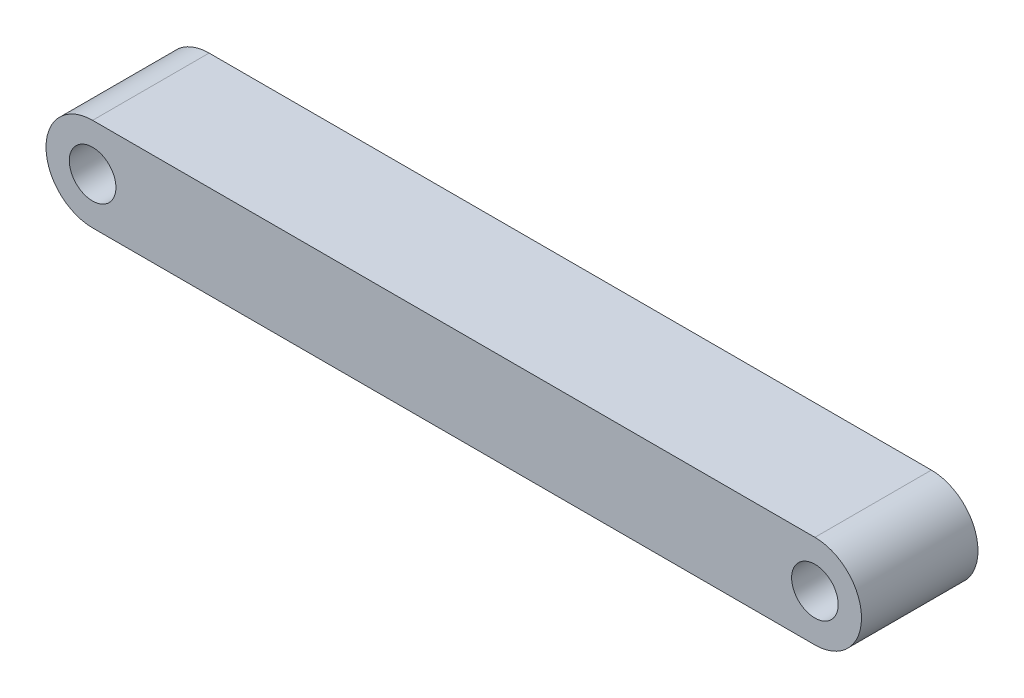
ISO-10303-21;
HEADER;
FILE_DESCRIPTION(('STEP AP214'),'2;1');
FILE_NAME('part.step','',(''),(''),'','','');
FILE_SCHEMA(('AUTOMOTIVE_DESIGN { 1 0 10303 214 1 1 1 1 }'));
ENDSEC;
DATA;
#1=APPLICATION_CONTEXT('core data for automotive mechanical design processes');
#2=APPLICATION_PROTOCOL_DEFINITION('international standard','automotive_design',2000,#1);
#3=PRODUCT_CONTEXT('',#1,'mechanical');
#4=PRODUCT('Part','Part','',(#3));
#5=PRODUCT_RELATED_PRODUCT_CATEGORY('part','',(#4));
#6=PRODUCT_DEFINITION_FORMATION('','',#4);
#7=PRODUCT_DEFINITION_CONTEXT('part definition',#1,'design');
#8=PRODUCT_DEFINITION('design','',#6,#7);
#9=PRODUCT_DEFINITION_SHAPE('','',#8);
#10=(LENGTH_UNIT() NAMED_UNIT(*) SI_UNIT(.MILLI.,.METRE.));
#11=(NAMED_UNIT(*) PLANE_ANGLE_UNIT() SI_UNIT($,.RADIAN.));
#12=(NAMED_UNIT(*) SI_UNIT($,.STERADIAN.) SOLID_ANGLE_UNIT());
#13=UNCERTAINTY_MEASURE_WITH_UNIT(LENGTH_MEASURE(1.E-05),#10,'distance_accuracy_value','');
#14=(GEOMETRIC_REPRESENTATION_CONTEXT(3) GLOBAL_UNCERTAINTY_ASSIGNED_CONTEXT((#13)) GLOBAL_UNIT_ASSIGNED_CONTEXT((#10,
#11,#12)) REPRESENTATION_CONTEXT('',''));
#15=CARTESIAN_POINT('',(0.,0.,0.));
#16=DIRECTION('',(0.,0.,1.));
#17=DIRECTION('',(1.,0.,0.));
#18=AXIS2_PLACEMENT_3D('',#15,#16,#17);
#19=CARTESIAN_POINT('',(0.,0.,10.));
#20=DIRECTION('',(0.,0.,1.));
#21=DIRECTION('',(1.,0.,0.));
#22=AXIS2_PLACEMENT_3D('',#19,#20,#21);
#23=PLANE('',#22);
#24=CARTESIAN_POINT('',(0.,0.,10.));
#25=DIRECTION('',(0.,0.,1.));
#26=DIRECTION('',(1.,0.,0.));
#27=AXIS2_PLACEMENT_3D('',#24,#25,#26);
#28=CIRCLE('',#27,2.);
#29=CARTESIAN_POINT('',(2.,0.,10.));
#30=VERTEX_POINT('',#29);
#31=EDGE_CURVE('E112',#30,#30,#28,.T.);
#32=ORIENTED_EDGE('',*,*,#31,.F.);
#33=EDGE_LOOP('',(#32));
#34=FACE_BOUND('',#33,.T.);
#35=CARTESIAN_POINT('',(0.,0.,10.));
#36=DIRECTION('',(0.,0.,1.));
#37=DIRECTION('',(1.,0.,0.));
#38=AXIS2_PLACEMENT_3D('',#35,#36,#37);
#39=CIRCLE('',#38,4.);
#40=CARTESIAN_POINT('',(0.,4.,10.));
#41=VERTEX_POINT('',#40);
#42=CARTESIAN_POINT('',(0.,-4.,10.));
#43=VERTEX_POINT('',#42);
#44=EDGE_CURVE('E92',#41,#43,#39,.T.);
#45=ORIENTED_EDGE('',*,*,#44,.T.);
#46=DIRECTION('',(1.,0.,0.));
#47=VECTOR('',#46,1.);
#48=CARTESIAN_POINT('',(0.,-4.,10.));
#49=LINE('',#48,#47);
#50=CARTESIAN_POINT('',(62.,-4.,10.));
#51=VERTEX_POINT('',#50);
#52=EDGE_CURVE('E87',#43,#51,#49,.T.);
#53=ORIENTED_EDGE('',*,*,#52,.T.);
#54=CARTESIAN_POINT('',(62.,0.,10.));
#55=DIRECTION('',(0.,0.,1.));
#56=DIRECTION('',(1.,0.,0.));
#57=AXIS2_PLACEMENT_3D('',#54,#55,#56);
#58=CIRCLE('',#57,4.);
#59=CARTESIAN_POINT('',(62.,4.,10.));
#60=VERTEX_POINT('',#59);
#61=EDGE_CURVE('E90',#51,#60,#58,.T.);
#62=ORIENTED_EDGE('',*,*,#61,.T.);
#63=DIRECTION('',(-1.,0.,0.));
#64=VECTOR('',#63,1.);
#65=CARTESIAN_POINT('',(0.,4.,10.));
#66=LINE('',#65,#64);
#67=EDGE_CURVE('E57',#60,#41,#66,.T.);
#68=ORIENTED_EDGE('',*,*,#67,.T.);
#69=EDGE_LOOP('',(#45,#53,#62,#68));
#70=FACE_BOUND('',#69,.T.);
#71=CARTESIAN_POINT('',(62.,0.,10.));
#72=DIRECTION('',(0.,0.,1.));
#73=DIRECTION('',(1.,0.,0.));
#74=AXIS2_PLACEMENT_3D('',#71,#72,#73);
#75=CIRCLE('',#74,2.);
#76=CARTESIAN_POINT('',(64.,0.,10.));
#77=VERTEX_POINT('',#76);
#78=EDGE_CURVE('E134',#77,#77,#75,.T.);
#79=ORIENTED_EDGE('',*,*,#78,.F.);
#80=EDGE_LOOP('',(#79));
#81=FACE_BOUND('',#80,.T.);
#82=ADVANCED_FACE('F39',(#34,#70,#81),#23,.T.);
#83=CARTESIAN_POINT('',(0.,0.,0.));
#84=DIRECTION('',(0.,0.,1.));
#85=DIRECTION('',(1.,0.,0.));
#86=AXIS2_PLACEMENT_3D('',#83,#84,#85);
#87=PLANE('',#86);
#88=CARTESIAN_POINT('',(0.,0.,0.));
#89=DIRECTION('',(0.,0.,1.));
#90=DIRECTION('',(1.,0.,0.));
#91=AXIS2_PLACEMENT_3D('',#88,#89,#90);
#92=CIRCLE('',#91,4.);
#93=CARTESIAN_POINT('',(0.,4.,0.));
#94=VERTEX_POINT('',#93);
#95=CARTESIAN_POINT('',(0.,-4.,0.));
#96=VERTEX_POINT('',#95);
#97=EDGE_CURVE('E108',#94,#96,#92,.T.);
#98=ORIENTED_EDGE('',*,*,#97,.F.);
#99=DIRECTION('',(-1.,0.,0.));
#100=VECTOR('',#99,1.);
#101=CARTESIAN_POINT('',(0.,4.,0.));
#102=LINE('',#101,#100);
#103=CARTESIAN_POINT('',(62.,4.,0.));
#104=VERTEX_POINT('',#103);
#105=EDGE_CURVE('E80',#104,#94,#102,.T.);
#106=ORIENTED_EDGE('',*,*,#105,.F.);
#107=CARTESIAN_POINT('',(62.,0.,0.));
#108=DIRECTION('',(0.,0.,1.));
#109=DIRECTION('',(1.,0.,0.));
#110=AXIS2_PLACEMENT_3D('',#107,#108,#109);
#111=CIRCLE('',#110,4.);
#112=CARTESIAN_POINT('',(62.,-4.,0.));
#113=VERTEX_POINT('',#112);
#114=EDGE_CURVE('E74',#113,#104,#111,.T.);
#115=ORIENTED_EDGE('',*,*,#114,.F.);
#116=DIRECTION('',(1.,0.,0.));
#117=VECTOR('',#116,1.);
#118=CARTESIAN_POINT('',(0.,-4.,0.));
#119=LINE('',#118,#117);
#120=EDGE_CURVE('E97',#96,#113,#119,.T.);
#121=ORIENTED_EDGE('',*,*,#120,.F.);
#122=EDGE_LOOP('',(#98,#106,#115,#121));
#123=FACE_BOUND('',#122,.T.);
#124=CARTESIAN_POINT('',(0.,0.,0.));
#125=DIRECTION('',(0.,0.,1.));
#126=DIRECTION('',(1.,0.,0.));
#127=AXIS2_PLACEMENT_3D('',#124,#125,#126);
#128=CIRCLE('',#127,2.);
#129=CARTESIAN_POINT('',(2.,0.,0.));
#130=VERTEX_POINT('',#129);
#131=EDGE_CURVE('E130',#130,#130,#128,.T.);
#132=ORIENTED_EDGE('',*,*,#131,.T.);
#133=EDGE_LOOP('',(#132));
#134=FACE_BOUND('',#133,.T.);
#135=CARTESIAN_POINT('',(62.,0.,0.));
#136=DIRECTION('',(0.,0.,1.));
#137=DIRECTION('',(1.,0.,0.));
#138=AXIS2_PLACEMENT_3D('',#135,#136,#137);
#139=CIRCLE('',#138,2.);
#140=CARTESIAN_POINT('',(64.,0.,0.));
#141=VERTEX_POINT('',#140);
#142=EDGE_CURVE('E138',#141,#141,#139,.T.);
#143=ORIENTED_EDGE('',*,*,#142,.T.);
#144=EDGE_LOOP('',(#143));
#145=FACE_BOUND('',#144,.T.);
#146=ADVANCED_FACE('F125',(#123,#134,#145),#87,.F.);
#147=CARTESIAN_POINT('',(0.,0.,10.));
#148=DIRECTION('',(0.,0.,-1.));
#149=DIRECTION('',(-1.,0.,0.));
#150=AXIS2_PLACEMENT_3D('',#147,#148,#149);
#151=CYLINDRICAL_SURFACE('',#150,4.);
#152=ORIENTED_EDGE('',*,*,#97,.T.);
#153=DIRECTION('',(0.,0.,-1.));
#154=VECTOR('',#153,1.);
#155=CARTESIAN_POINT('',(0.,-4.,10.));
#156=LINE('',#155,#154);
#157=EDGE_CURVE('E11',#43,#96,#156,.T.);
#158=ORIENTED_EDGE('',*,*,#157,.F.);
#159=ORIENTED_EDGE('',*,*,#44,.F.);
#160=DIRECTION('',(0.,0.,-1.));
#161=VECTOR('',#160,1.);
#162=CARTESIAN_POINT('',(0.,4.,10.));
#163=LINE('',#162,#161);
#164=EDGE_CURVE('E104',#41,#94,#163,.T.);
#165=ORIENTED_EDGE('',*,*,#164,.T.);
#166=EDGE_LOOP('',(#152,#158,#159,#165));
#167=FACE_BOUND('',#166,.T.);
#168=ADVANCED_FACE('F41',(#167),#151,.T.);
#169=CARTESIAN_POINT('',(0.,-4.,10.));
#170=DIRECTION('',(0.,1.,0.));
#171=DIRECTION('',(0.,0.,1.));
#172=AXIS2_PLACEMENT_3D('',#169,#170,#171);
#173=PLANE('',#172);
#174=ORIENTED_EDGE('',*,*,#120,.T.);
#175=DIRECTION('',(0.,0.,-1.));
#176=VECTOR('',#175,1.);
#177=CARTESIAN_POINT('',(62.,-4.,10.));
#178=LINE('',#177,#176);
#179=EDGE_CURVE('E49',#51,#113,#178,.T.);
#180=ORIENTED_EDGE('',*,*,#179,.F.);
#181=ORIENTED_EDGE('',*,*,#52,.F.);
#182=ORIENTED_EDGE('',*,*,#157,.T.);
#183=EDGE_LOOP('',(#174,#180,#181,#182));
#184=FACE_BOUND('',#183,.T.);
#185=ADVANCED_FACE('F96',(#184),#173,.F.);
#186=CARTESIAN_POINT('',(62.,0.,10.));
#187=DIRECTION('',(0.,0.,-1.));
#188=DIRECTION('',(-1.,0.,0.));
#189=AXIS2_PLACEMENT_3D('',#186,#187,#188);
#190=CYLINDRICAL_SURFACE('',#189,4.);
#191=ORIENTED_EDGE('',*,*,#114,.T.);
#192=DIRECTION('',(0.,0.,-1.));
#193=VECTOR('',#192,1.);
#194=CARTESIAN_POINT('',(62.,4.,10.));
#195=LINE('',#194,#193);
#196=EDGE_CURVE('E99',#60,#104,#195,.T.);
#197=ORIENTED_EDGE('',*,*,#196,.F.);
#198=ORIENTED_EDGE('',*,*,#61,.F.);
#199=ORIENTED_EDGE('',*,*,#179,.T.);
#200=EDGE_LOOP('',(#191,#197,#198,#199));
#201=FACE_BOUND('',#200,.T.);
#202=ADVANCED_FACE('F100',(#201),#190,.T.);
#203=CARTESIAN_POINT('',(0.,4.,10.));
#204=DIRECTION('',(0.,-1.,0.));
#205=DIRECTION('',(0.,0.,-1.));
#206=AXIS2_PLACEMENT_3D('',#203,#204,#205);
#207=PLANE('',#206);
#208=ORIENTED_EDGE('',*,*,#105,.T.);
#209=ORIENTED_EDGE('',*,*,#164,.F.);
#210=ORIENTED_EDGE('',*,*,#67,.F.);
#211=ORIENTED_EDGE('',*,*,#196,.T.);
#212=EDGE_LOOP('',(#208,#209,#210,#211));
#213=FACE_BOUND('',#212,.T.);
#214=ADVANCED_FACE('F122',(#213),#207,.F.);
#215=CARTESIAN_POINT('',(0.,0.,10.));
#216=DIRECTION('',(0.,0.,-1.));
#217=DIRECTION('',(-1.,0.,0.));
#218=AXIS2_PLACEMENT_3D('',#215,#216,#217);
#219=CYLINDRICAL_SURFACE('',#218,2.);
#220=ORIENTED_EDGE('',*,*,#31,.T.);
#221=EDGE_LOOP('',(#220));
#222=FACE_BOUND('',#221,.T.);
#223=ORIENTED_EDGE('',*,*,#131,.F.);
#224=EDGE_LOOP('',(#223));
#225=FACE_BOUND('',#224,.T.);
#226=ADVANCED_FACE('F157',(#222,#225),#219,.F.);
#227=CARTESIAN_POINT('',(62.,0.,10.));
#228=DIRECTION('',(0.,0.,-1.));
#229=DIRECTION('',(-1.,0.,0.));
#230=AXIS2_PLACEMENT_3D('',#227,#228,#229);
#231=CYLINDRICAL_SURFACE('',#230,2.);
#232=ORIENTED_EDGE('',*,*,#78,.T.);
#233=EDGE_LOOP('',(#232));
#234=FACE_BOUND('',#233,.T.);
#235=ORIENTED_EDGE('',*,*,#142,.F.);
#236=EDGE_LOOP('',(#235));
#237=FACE_BOUND('',#236,.T.);
#238=ADVANCED_FACE('F146',(#234,#237),#231,.F.);
#239=CLOSED_SHELL('',(#82,#146,#168,#185,#202,#214,#226,#238));
#240=MANIFOLD_SOLID_BREP('B2',#239);
#241=ADVANCED_BREP_SHAPE_REPRESENTATION('',(#18,#240),#14);
#242=SHAPE_DEFINITION_REPRESENTATION(#9,#241);
ENDSEC;
END-ISO-10303-21;
